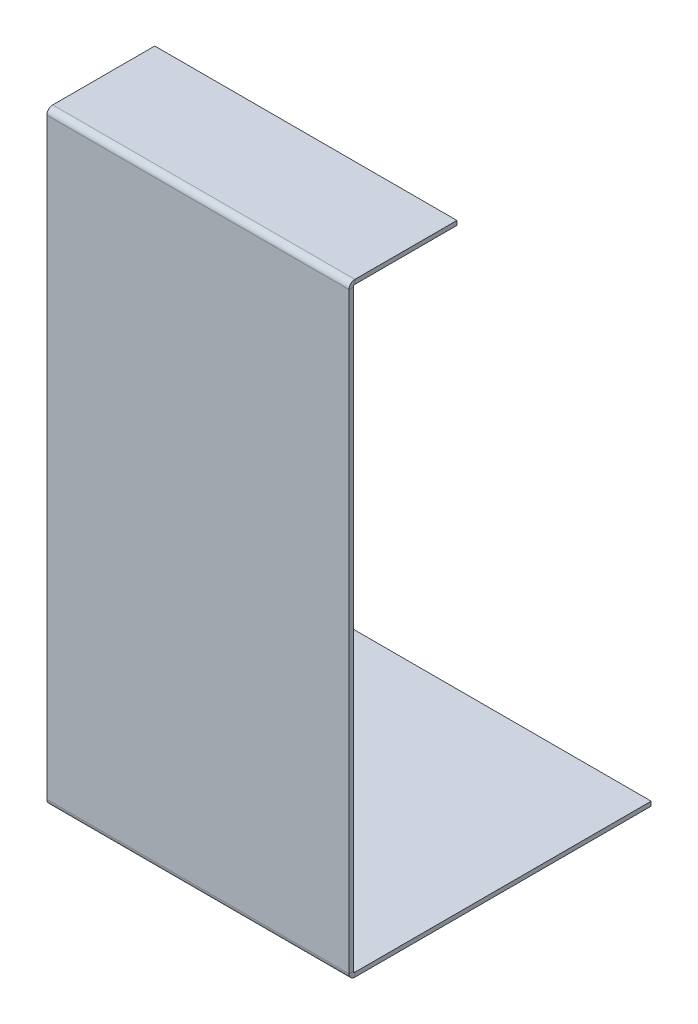
ISO-10303-21;
HEADER;
FILE_DESCRIPTION(('STEP AP214'),'2;1');
FILE_NAME('part.step','',(''),(''),'','','');
FILE_SCHEMA(('AUTOMOTIVE_DESIGN { 1 0 10303 214 1 1 1 1 }'));
ENDSEC;
DATA;
#1=APPLICATION_CONTEXT('core data for automotive mechanical design processes');
#2=APPLICATION_PROTOCOL_DEFINITION('international standard','automotive_design',2000,#1);
#3=PRODUCT_CONTEXT('',#1,'mechanical');
#4=PRODUCT('Part','Part','',(#3));
#5=PRODUCT_RELATED_PRODUCT_CATEGORY('part','',(#4));
#6=PRODUCT_DEFINITION_FORMATION('','',#4);
#7=PRODUCT_DEFINITION_CONTEXT('part definition',#1,'design');
#8=PRODUCT_DEFINITION('design','',#6,#7);
#9=PRODUCT_DEFINITION_SHAPE('','',#8);
#10=(LENGTH_UNIT() NAMED_UNIT(*) SI_UNIT(.MILLI.,.METRE.));
#11=(NAMED_UNIT(*) PLANE_ANGLE_UNIT() SI_UNIT($,.RADIAN.));
#12=(NAMED_UNIT(*) SI_UNIT($,.STERADIAN.) SOLID_ANGLE_UNIT());
#13=UNCERTAINTY_MEASURE_WITH_UNIT(LENGTH_MEASURE(1.E-05),#10,'distance_accuracy_value','');
#14=(GEOMETRIC_REPRESENTATION_CONTEXT(3) GLOBAL_UNCERTAINTY_ASSIGNED_CONTEXT((#13)) GLOBAL_UNIT_ASSIGNED_CONTEXT((#10,
#11,#12)) REPRESENTATION_CONTEXT('',''));
#15=CARTESIAN_POINT('',(0.,0.,0.));
#16=DIRECTION('',(0.,0.,1.));
#17=DIRECTION('',(1.,0.,0.));
#18=AXIS2_PLACEMENT_3D('',#15,#16,#17);
#19=CARTESIAN_POINT('',(-78.7205387205387,0.,95.5331088664422));
#20=DIRECTION('',(1.,0.,0.));
#21=DIRECTION('',(0.,0.,-1.));
#22=AXIS2_PLACEMENT_3D('',#19,#20,#21);
#23=PLANE('',#22);
#24=DIRECTION('',(0.,0.,1.));
#25=VECTOR('',#24,1.);
#26=CARTESIAN_POINT('',(-78.7205387205387,275.2634,93.5331088664422));
#27=LINE('',#26,#25);
#28=CARTESIAN_POINT('',(-78.7205387205387,275.2634,93.5331088664422));
#29=VERTEX_POINT('',#28);
#30=CARTESIAN_POINT('',(-78.7205387205387,275.2634,95.5331088664422));
#31=VERTEX_POINT('',#30);
#32=EDGE_CURVE('E230',#29,#31,#27,.T.);
#33=ORIENTED_EDGE('',*,*,#32,.F.);
#34=DIRECTION('',(0.,1.,0.));
#35=VECTOR('',#34,1.);
#36=CARTESIAN_POINT('',(-78.7205387205387,0.,93.5331088664422));
#37=LINE('',#36,#35);
#38=CARTESIAN_POINT('',(-78.7205387205387,0.736600000000004,93.5331088664422));
#39=VERTEX_POINT('',#38);
#40=EDGE_CURVE('E243',#29,#39,#37,.F.);
#41=ORIENTED_EDGE('',*,*,#40,.T.);
#42=DIRECTION('',(0.,0.,-1.));
#43=VECTOR('',#42,1.);
#44=CARTESIAN_POINT('',(-78.7205387205387,0.736600000000004,95.5331088664422));
#45=LINE('',#44,#43);
#46=CARTESIAN_POINT('',(-78.7205387205387,0.736600000000004,95.5331088664422));
#47=VERTEX_POINT('',#46);
#48=EDGE_CURVE('E233',#39,#47,#45,.F.);
#49=ORIENTED_EDGE('',*,*,#48,.T.);
#50=DIRECTION('',(0.,-1.,0.));
#51=VECTOR('',#50,1.);
#52=CARTESIAN_POINT('',(-78.7205387205387,0.,95.5331088664422));
#53=LINE('',#52,#51);
#54=EDGE_CURVE('E239',#31,#47,#53,.T.);
#55=ORIENTED_EDGE('',*,*,#54,.F.);
#56=EDGE_LOOP('',(#33,#41,#49,#55));
#57=FACE_BOUND('',#56,.T.);
#58=ADVANCED_FACE('F81',(#57),#23,.F.);
#59=CARTESIAN_POINT('',(61.2794612794613,278.,95.5331088664422));
#60=DIRECTION('',(-1.,0.,0.));
#61=DIRECTION('',(0.,0.,1.));
#62=AXIS2_PLACEMENT_3D('',#59,#60,#61);
#63=PLANE('',#62);
#64=DIRECTION('',(0.,0.,1.));
#65=VECTOR('',#64,1.);
#66=CARTESIAN_POINT('',(61.2794612794613,275.2634,93.5331088664422));
#67=LINE('',#66,#65);
#68=CARTESIAN_POINT('',(61.2794612794613,275.2634,93.5331088664422));
#69=VERTEX_POINT('',#68);
#70=CARTESIAN_POINT('',(61.2794612794613,275.2634,95.5331088664422));
#71=VERTEX_POINT('',#70);
#72=EDGE_CURVE('E220',#69,#71,#67,.T.);
#73=ORIENTED_EDGE('',*,*,#72,.T.);
#74=DIRECTION('',(0.,1.,0.));
#75=VECTOR('',#74,1.);
#76=CARTESIAN_POINT('',(61.2794612794613,0.,95.5331088664422));
#77=LINE('',#76,#75);
#78=CARTESIAN_POINT('',(61.2794612794613,0.736600000000004,95.5331088664422));
#79=VERTEX_POINT('',#78);
#80=EDGE_CURVE('E236',#79,#71,#77,.T.);
#81=ORIENTED_EDGE('',*,*,#80,.F.);
#82=DIRECTION('',(0.,0.,-1.));
#83=VECTOR('',#82,1.);
#84=CARTESIAN_POINT('',(61.2794612794613,0.736600000000004,93.5331088664422));
#85=LINE('',#84,#83);
#86=CARTESIAN_POINT('',(61.2794612794613,0.736600000000004,93.5331088664422));
#87=VERTEX_POINT('',#86);
#88=EDGE_CURVE('E248',#87,#79,#85,.F.);
#89=ORIENTED_EDGE('',*,*,#88,.F.);
#90=DIRECTION('',(0.,-1.,0.));
#91=VECTOR('',#90,1.);
#92=CARTESIAN_POINT('',(61.2794612794613,278.,93.5331088664422));
#93=LINE('',#92,#91);
#94=EDGE_CURVE('E241',#87,#69,#93,.F.);
#95=ORIENTED_EDGE('',*,*,#94,.T.);
#96=EDGE_LOOP('',(#73,#81,#89,#95));
#97=FACE_BOUND('',#96,.T.);
#98=ADVANCED_FACE('F314',(#97),#63,.F.);
#99=CARTESIAN_POINT('',(0.,0.,95.5331088664422));
#100=DIRECTION('',(0.,0.,-1.));
#101=DIRECTION('',(-1.,0.,0.));
#102=AXIS2_PLACEMENT_3D('',#99,#100,#101);
#103=PLANE('',#102);
#104=DIRECTION('',(1.,0.,0.));
#105=VECTOR('',#104,1.);
#106=CARTESIAN_POINT('',(61.2794612794613,275.2634,95.5331088664422));
#107=LINE('',#106,#105);
#108=EDGE_CURVE('E214',#71,#31,#107,.F.);
#109=ORIENTED_EDGE('',*,*,#108,.T.);
#110=ORIENTED_EDGE('',*,*,#54,.T.);
#111=DIRECTION('',(1.,0.,0.));
#112=VECTOR('',#111,1.);
#113=CARTESIAN_POINT('',(-78.7205387205387,0.736600000000004,95.5331088664422));
#114=LINE('',#113,#112);
#115=EDGE_CURVE('E245',#79,#47,#114,.F.);
#116=ORIENTED_EDGE('',*,*,#115,.F.);
#117=ORIENTED_EDGE('',*,*,#80,.T.);
#118=EDGE_LOOP('',(#109,#110,#116,#117));
#119=FACE_BOUND('',#118,.T.);
#120=ADVANCED_FACE('F310',(#119),#103,.F.);
#121=CARTESIAN_POINT('',(0.,0.,93.5331088664422));
#122=DIRECTION('',(0.,0.,-1.));
#123=DIRECTION('',(-1.,0.,0.));
#124=AXIS2_PLACEMENT_3D('',#121,#122,#123);
#125=PLANE('',#124);
#126=ORIENTED_EDGE('',*,*,#40,.F.);
#127=DIRECTION('',(1.,0.,0.));
#128=VECTOR('',#127,1.);
#129=CARTESIAN_POINT('',(61.2794612794613,275.2634,93.5331088664422));
#130=LINE('',#129,#128);
#131=EDGE_CURVE('E96',#69,#29,#130,.F.);
#132=ORIENTED_EDGE('',*,*,#131,.F.);
#133=ORIENTED_EDGE('',*,*,#94,.F.);
#134=DIRECTION('',(1.,0.,0.));
#135=VECTOR('',#134,1.);
#136=CARTESIAN_POINT('',(-78.7205387205387,0.736600000000004,93.5331088664422));
#137=LINE('',#136,#135);
#138=EDGE_CURVE('E251',#39,#87,#137,.T.);
#139=ORIENTED_EDGE('',*,*,#138,.F.);
#140=EDGE_LOOP('',(#126,#132,#133,#139));
#141=FACE_BOUND('',#140,.T.);
#142=ADVANCED_FACE('F337',(#141),#125,.T.);
#143=CARTESIAN_POINT('',(61.2794612794613,-2.,-44.4668911335578));
#144=DIRECTION('',(1.,0.,0.));
#145=DIRECTION('',(0.,0.,-1.));
#146=AXIS2_PLACEMENT_3D('',#143,#144,#145);
#147=PLANE('',#146);
#148=DIRECTION('',(0.,0.,-1.));
#149=VECTOR('',#148,1.);
#150=CARTESIAN_POINT('',(61.2794612794613,0.,-44.4668911335578));
#151=LINE('',#150,#149);
#152=CARTESIAN_POINT('',(61.2794612794613,0.,92.7965088664422));
#153=VERTEX_POINT('',#152);
#154=CARTESIAN_POINT('',(61.2794612794613,0.,-44.4668911335578));
#155=VERTEX_POINT('',#154);
#156=EDGE_CURVE('E286',#153,#155,#151,.T.);
#157=ORIENTED_EDGE('',*,*,#156,.F.);
#158=DIRECTION('',(0.,-1.,0.));
#159=VECTOR('',#158,1.);
#160=CARTESIAN_POINT('',(61.2794612794613,0.,92.7965088664422));
#161=LINE('',#160,#159);
#162=CARTESIAN_POINT('',(61.2794612794613,-2.,92.7965088664422));
#163=VERTEX_POINT('',#162);
#164=EDGE_CURVE('E261',#153,#163,#161,.T.);
#165=ORIENTED_EDGE('',*,*,#164,.T.);
#166=DIRECTION('',(0.,0.,-1.));
#167=VECTOR('',#166,1.);
#168=CARTESIAN_POINT('',(61.2794612794613,-2.,-44.4668911335578));
#169=LINE('',#168,#167);
#170=CARTESIAN_POINT('',(61.2794612794613,-2.,-44.4668911335578));
#171=VERTEX_POINT('',#170);
#172=EDGE_CURVE('E279',#163,#171,#169,.T.);
#173=ORIENTED_EDGE('',*,*,#172,.T.);
#174=DIRECTION('',(0.,1.,0.));
#175=VECTOR('',#174,1.);
#176=CARTESIAN_POINT('',(61.2794612794613,-2.,-44.4668911335578));
#177=LINE('',#176,#175);
#178=EDGE_CURVE('E85',#171,#155,#177,.T.);
#179=ORIENTED_EDGE('',*,*,#178,.T.);
#180=EDGE_LOOP('',(#157,#165,#173,#179));
#181=FACE_BOUND('',#180,.T.);
#182=ADVANCED_FACE('F345',(#181),#147,.T.);
#183=CARTESIAN_POINT('',(0.,-2.,0.));
#184=DIRECTION('',(0.,1.,0.));
#185=DIRECTION('',(0.,0.,1.));
#186=AXIS2_PLACEMENT_3D('',#183,#184,#185);
#187=PLANE('',#186);
#188=DIRECTION('',(1.,0.,0.));
#189=VECTOR('',#188,1.);
#190=CARTESIAN_POINT('',(61.2794612794613,-2.,92.7965088664422));
#191=LINE('',#190,#189);
#192=CARTESIAN_POINT('',(-78.7205387205387,-2.,92.7965088664422));
#193=VERTEX_POINT('',#192);
#194=EDGE_CURVE('E255',#163,#193,#191,.F.);
#195=ORIENTED_EDGE('',*,*,#194,.T.);
#196=DIRECTION('',(0.,0.,1.));
#197=VECTOR('',#196,1.);
#198=CARTESIAN_POINT('',(-78.7205387205387,-2.,-44.4668911335578));
#199=LINE('',#198,#197);
#200=CARTESIAN_POINT('',(-78.7205387205387,-2.,-44.4668911335578));
#201=VERTEX_POINT('',#200);
#202=EDGE_CURVE('E276',#201,#193,#199,.T.);
#203=ORIENTED_EDGE('',*,*,#202,.F.);
#204=DIRECTION('',(-1.,0.,0.));
#205=VECTOR('',#204,1.);
#206=CARTESIAN_POINT('',(-78.7205387205387,-2.,-44.4668911335578));
#207=LINE('',#206,#205);
#208=EDGE_CURVE('E282',#171,#201,#207,.T.);
#209=ORIENTED_EDGE('',*,*,#208,.F.);
#210=ORIENTED_EDGE('',*,*,#172,.F.);
#211=EDGE_LOOP('',(#195,#203,#209,#210));
#212=FACE_BOUND('',#211,.T.);
#213=ADVANCED_FACE('F347',(#212),#187,.F.);
#214=CARTESIAN_POINT('',(0.,0.,0.));
#215=DIRECTION('',(0.,1.,0.));
#216=DIRECTION('',(0.,0.,1.));
#217=AXIS2_PLACEMENT_3D('',#214,#215,#216);
#218=PLANE('',#217);
#219=DIRECTION('',(0.,0.,1.));
#220=VECTOR('',#219,1.);
#221=CARTESIAN_POINT('',(-78.7205387205387,0.,-44.4668911335578));
#222=LINE('',#221,#220);
#223=CARTESIAN_POINT('',(-78.7205387205387,0.,-44.4668911335578));
#224=VERTEX_POINT('',#223);
#225=CARTESIAN_POINT('',(-78.7205387205387,0.,92.7965088664422));
#226=VERTEX_POINT('',#225);
#227=EDGE_CURVE('E273',#224,#226,#222,.T.);
#228=ORIENTED_EDGE('',*,*,#227,.T.);
#229=DIRECTION('',(1.,0.,0.));
#230=VECTOR('',#229,1.);
#231=CARTESIAN_POINT('',(61.2794612794613,0.,92.7965088664422));
#232=LINE('',#231,#230);
#233=EDGE_CURVE('E104',#153,#226,#232,.F.);
#234=ORIENTED_EDGE('',*,*,#233,.F.);
#235=ORIENTED_EDGE('',*,*,#156,.T.);
#236=DIRECTION('',(-1.,0.,0.));
#237=VECTOR('',#236,1.);
#238=CARTESIAN_POINT('',(-78.7205387205387,0.,-44.4668911335578));
#239=LINE('',#238,#237);
#240=EDGE_CURVE('E280',#155,#224,#239,.T.);
#241=ORIENTED_EDGE('',*,*,#240,.T.);
#242=EDGE_LOOP('',(#228,#234,#235,#241));
#243=FACE_BOUND('',#242,.T.);
#244=ADVANCED_FACE('F290',(#243),#218,.T.);
#245=CARTESIAN_POINT('',(-78.7205387205387,-2.,-44.4668911335578));
#246=DIRECTION('',(-1.,0.,0.));
#247=DIRECTION('',(0.,0.,1.));
#248=AXIS2_PLACEMENT_3D('',#245,#246,#247);
#249=PLANE('',#248);
#250=DIRECTION('',(0.,-1.,0.));
#251=VECTOR('',#250,1.);
#252=CARTESIAN_POINT('',(-78.7205387205387,0.,92.7965088664422));
#253=LINE('',#252,#251);
#254=EDGE_CURVE('E270',#226,#193,#253,.T.);
#255=ORIENTED_EDGE('',*,*,#254,.F.);
#256=ORIENTED_EDGE('',*,*,#227,.F.);
#257=DIRECTION('',(0.,1.,0.));
#258=VECTOR('',#257,1.);
#259=CARTESIAN_POINT('',(-78.7205387205387,-2.,-44.4668911335578));
#260=LINE('',#259,#258);
#261=EDGE_CURVE('E13',#201,#224,#260,.T.);
#262=ORIENTED_EDGE('',*,*,#261,.F.);
#263=ORIENTED_EDGE('',*,*,#202,.T.);
#264=EDGE_LOOP('',(#255,#256,#262,#263));
#265=FACE_BOUND('',#264,.T.);
#266=ADVANCED_FACE('F83',(#265),#249,.T.);
#267=CARTESIAN_POINT('',(-78.7205387205387,-2.,-44.4668911335578));
#268=DIRECTION('',(0.,0.,-1.));
#269=DIRECTION('',(-1.,0.,0.));
#270=AXIS2_PLACEMENT_3D('',#267,#268,#269);
#271=PLANE('',#270);
#272=ORIENTED_EDGE('',*,*,#240,.F.);
#273=ORIENTED_EDGE('',*,*,#178,.F.);
#274=ORIENTED_EDGE('',*,*,#208,.T.);
#275=ORIENTED_EDGE('',*,*,#261,.T.);
#276=EDGE_LOOP('',(#272,#273,#274,#275));
#277=FACE_BOUND('',#276,.T.);
#278=ADVANCED_FACE('F295',(#277),#271,.T.);
#279=CARTESIAN_POINT('',(-78.7205387205387,0.736600000000004,92.7965088664422));
#280=DIRECTION('',(-1.,0.,0.));
#281=DIRECTION('',(0.,0.,1.));
#282=AXIS2_PLACEMENT_3D('',#279,#280,#281);
#283=PLANE('',#282);
#284=ORIENTED_EDGE('',*,*,#48,.F.);
#285=CARTESIAN_POINT('',(-78.7205387205387,0.736600000000004,92.7965088664422));
#286=DIRECTION('',(1.,0.,0.));
#287=DIRECTION('',(0.,0.,-1.));
#288=AXIS2_PLACEMENT_3D('',#285,#286,#287);
#289=CIRCLE('',#288,0.736600000000004);
#290=EDGE_CURVE('E264',#226,#39,#289,.F.);
#291=ORIENTED_EDGE('',*,*,#290,.F.);
#292=ORIENTED_EDGE('',*,*,#254,.T.);
#293=CARTESIAN_POINT('',(-78.7205387205387,0.736600000000004,92.7965088664422));
#294=DIRECTION('',(1.,0.,0.));
#295=DIRECTION('',(0.,0.,-1.));
#296=AXIS2_PLACEMENT_3D('',#293,#294,#295);
#297=CIRCLE('',#296,2.7366);
#298=EDGE_CURVE('E257',#193,#47,#297,.F.);
#299=ORIENTED_EDGE('',*,*,#298,.T.);
#300=EDGE_LOOP('',(#284,#291,#292,#299));
#301=FACE_BOUND('',#300,.T.);
#302=ADVANCED_FACE('F303',(#301),#283,.T.);
#303=CARTESIAN_POINT('',(61.2794612794613,0.736600000000004,92.7965088664422));
#304=DIRECTION('',(-1.,0.,0.));
#305=DIRECTION('',(0.,0.,1.));
#306=AXIS2_PLACEMENT_3D('',#303,#304,#305);
#307=PLANE('',#306);
#308=CARTESIAN_POINT('',(61.2794612794613,0.736600000000004,92.7965088664422));
#309=DIRECTION('',(1.,0.,0.));
#310=DIRECTION('',(0.,0.,-1.));
#311=AXIS2_PLACEMENT_3D('',#308,#309,#310);
#312=CIRCLE('',#311,0.736600000000004);
#313=EDGE_CURVE('E238',#87,#153,#312,.T.);
#314=ORIENTED_EDGE('',*,*,#313,.F.);
#315=ORIENTED_EDGE('',*,*,#88,.T.);
#316=CARTESIAN_POINT('',(61.2794612794613,0.736600000000004,92.7965088664422));
#317=DIRECTION('',(1.,0.,0.));
#318=DIRECTION('',(0.,0.,-1.));
#319=AXIS2_PLACEMENT_3D('',#316,#317,#318);
#320=CIRCLE('',#319,2.7366);
#321=EDGE_CURVE('E258',#79,#163,#320,.T.);
#322=ORIENTED_EDGE('',*,*,#321,.T.);
#323=ORIENTED_EDGE('',*,*,#164,.F.);
#324=EDGE_LOOP('',(#314,#315,#322,#323));
#325=FACE_BOUND('',#324,.T.);
#326=ADVANCED_FACE('F343',(#325),#307,.F.);
#327=CARTESIAN_POINT('',(61.2794612794613,0.736600000000004,92.7965088664422));
#328=DIRECTION('',(1.,0.,0.));
#329=DIRECTION('',(0.,0.,1.));
#330=AXIS2_PLACEMENT_3D('',#327,#328,#329);
#331=CYLINDRICAL_SURFACE('',#330,2.7366);
#332=ORIENTED_EDGE('',*,*,#194,.F.);
#333=ORIENTED_EDGE('',*,*,#321,.F.);
#334=ORIENTED_EDGE('',*,*,#115,.T.);
#335=ORIENTED_EDGE('',*,*,#298,.F.);
#336=EDGE_LOOP('',(#332,#333,#334,#335));
#337=FACE_BOUND('',#336,.T.);
#338=ADVANCED_FACE('F306',(#337),#331,.T.);
#339=CARTESIAN_POINT('',(61.2794612794613,0.736600000000004,92.7965088664422));
#340=DIRECTION('',(1.,0.,0.));
#341=DIRECTION('',(0.,0.,1.));
#342=AXIS2_PLACEMENT_3D('',#339,#340,#341);
#343=CYLINDRICAL_SURFACE('',#342,0.736600000000004);
#344=ORIENTED_EDGE('',*,*,#233,.T.);
#345=ORIENTED_EDGE('',*,*,#290,.T.);
#346=ORIENTED_EDGE('',*,*,#138,.T.);
#347=ORIENTED_EDGE('',*,*,#313,.T.);
#348=EDGE_LOOP('',(#344,#345,#346,#347));
#349=FACE_BOUND('',#348,.T.);
#350=ADVANCED_FACE('F340',(#349),#343,.F.);
#351=CARTESIAN_POINT('',(-78.7205387205387,275.2634,92.7965088664422));
#352=DIRECTION('',(-1.,0.,0.));
#353=DIRECTION('',(0.,0.,1.));
#354=AXIS2_PLACEMENT_3D('',#351,#352,#353);
#355=PLANE('',#354);
#356=DIRECTION('',(0.,-1.,0.));
#357=VECTOR('',#356,1.);
#358=CARTESIAN_POINT('',(-78.7205387205387,278.,92.7965088664422));
#359=LINE('',#358,#357);
#360=CARTESIAN_POINT('',(-78.7205387205387,276.,92.7965088664422));
#361=VERTEX_POINT('',#360);
#362=CARTESIAN_POINT('',(-78.7205387205387,278.,92.7965088664422));
#363=VERTEX_POINT('',#362);
#364=EDGE_CURVE('E196',#361,#363,#359,.F.);
#365=ORIENTED_EDGE('',*,*,#364,.F.);
#366=CARTESIAN_POINT('',(-78.7205387205387,275.2634,92.7965088664422));
#367=DIRECTION('',(1.,0.,0.));
#368=DIRECTION('',(0.,0.,-1.));
#369=AXIS2_PLACEMENT_3D('',#366,#367,#368);
#370=CIRCLE('',#369,0.736599999999976);
#371=EDGE_CURVE('E223',#29,#361,#370,.F.);
#372=ORIENTED_EDGE('',*,*,#371,.F.);
#373=ORIENTED_EDGE('',*,*,#32,.T.);
#374=CARTESIAN_POINT('',(-78.7205387205387,275.2634,92.7965088664422));
#375=DIRECTION('',(1.,0.,0.));
#376=DIRECTION('',(0.,0.,-1.));
#377=AXIS2_PLACEMENT_3D('',#374,#375,#376);
#378=CIRCLE('',#377,2.73659999999998);
#379=EDGE_CURVE('E216',#31,#363,#378,.F.);
#380=ORIENTED_EDGE('',*,*,#379,.T.);
#381=EDGE_LOOP('',(#365,#372,#373,#380));
#382=FACE_BOUND('',#381,.T.);
#383=ADVANCED_FACE('F334',(#382),#355,.T.);
#384=CARTESIAN_POINT('',(61.2794612794613,275.2634,92.7965088664422));
#385=DIRECTION('',(-1.,0.,0.));
#386=DIRECTION('',(0.,0.,1.));
#387=AXIS2_PLACEMENT_3D('',#384,#385,#386);
#388=PLANE('',#387);
#389=CARTESIAN_POINT('',(61.2794612794613,275.2634,92.7965088664422));
#390=DIRECTION('',(1.,0.,0.));
#391=DIRECTION('',(0.,0.,-1.));
#392=AXIS2_PLACEMENT_3D('',#389,#390,#391);
#393=CIRCLE('',#392,0.736599999999976);
#394=CARTESIAN_POINT('',(61.2794612794613,276.,92.7965088664422));
#395=VERTEX_POINT('',#394);
#396=EDGE_CURVE('E227',#395,#69,#393,.T.);
#397=ORIENTED_EDGE('',*,*,#396,.F.);
#398=DIRECTION('',(0.,-1.,0.));
#399=VECTOR('',#398,1.);
#400=CARTESIAN_POINT('',(61.2794612794613,276.,92.7965088664422));
#401=LINE('',#400,#399);
#402=CARTESIAN_POINT('',(61.2794612794613,278.,92.7965088664422));
#403=VERTEX_POINT('',#402);
#404=EDGE_CURVE('E208',#395,#403,#401,.F.);
#405=ORIENTED_EDGE('',*,*,#404,.T.);
#406=CARTESIAN_POINT('',(61.2794612794613,275.2634,92.7965088664422));
#407=DIRECTION('',(1.,0.,0.));
#408=DIRECTION('',(0.,0.,-1.));
#409=AXIS2_PLACEMENT_3D('',#406,#407,#408);
#410=CIRCLE('',#409,2.73659999999998);
#411=EDGE_CURVE('E217',#403,#71,#410,.T.);
#412=ORIENTED_EDGE('',*,*,#411,.T.);
#413=ORIENTED_EDGE('',*,*,#72,.F.);
#414=EDGE_LOOP('',(#397,#405,#412,#413));
#415=FACE_BOUND('',#414,.T.);
#416=ADVANCED_FACE('F322',(#415),#388,.F.);
#417=CARTESIAN_POINT('',(61.2794612794613,275.2634,92.7965088664422));
#418=DIRECTION('',(1.,0.,0.));
#419=DIRECTION('',(0.,1.,0.));
#420=AXIS2_PLACEMENT_3D('',#417,#418,#419);
#421=CYLINDRICAL_SURFACE('',#420,2.73659999999998);
#422=ORIENTED_EDGE('',*,*,#108,.F.);
#423=ORIENTED_EDGE('',*,*,#411,.F.);
#424=DIRECTION('',(1.,0.,0.));
#425=VECTOR('',#424,1.);
#426=CARTESIAN_POINT('',(-78.7205387205387,278.,92.7965088664422));
#427=LINE('',#426,#425);
#428=EDGE_CURVE('E206',#403,#363,#427,.F.);
#429=ORIENTED_EDGE('',*,*,#428,.T.);
#430=ORIENTED_EDGE('',*,*,#379,.F.);
#431=EDGE_LOOP('',(#422,#423,#429,#430));
#432=FACE_BOUND('',#431,.T.);
#433=ADVANCED_FACE('F321',(#432),#421,.T.);
#434=CARTESIAN_POINT('',(61.2794612794613,275.2634,92.7965088664422));
#435=DIRECTION('',(1.,0.,0.));
#436=DIRECTION('',(0.,1.,0.));
#437=AXIS2_PLACEMENT_3D('',#434,#435,#436);
#438=CYLINDRICAL_SURFACE('',#437,0.736599999999976);
#439=ORIENTED_EDGE('',*,*,#131,.T.);
#440=ORIENTED_EDGE('',*,*,#371,.T.);
#441=DIRECTION('',(1.,0.,0.));
#442=VECTOR('',#441,1.);
#443=CARTESIAN_POINT('',(-78.7205387205387,276.,92.7965088664422));
#444=LINE('',#443,#442);
#445=EDGE_CURVE('E211',#361,#395,#444,.T.);
#446=ORIENTED_EDGE('',*,*,#445,.T.);
#447=ORIENTED_EDGE('',*,*,#396,.T.);
#448=EDGE_LOOP('',(#439,#440,#446,#447));
#449=FACE_BOUND('',#448,.T.);
#450=ADVANCED_FACE('F331',(#449),#438,.F.);
#451=CARTESIAN_POINT('',(61.2794612794613,278.,45.5331088664422));
#452=DIRECTION('',(-1.,0.,0.));
#453=DIRECTION('',(0.,0.,1.));
#454=AXIS2_PLACEMENT_3D('',#451,#452,#453);
#455=PLANE('',#454);
#456=ORIENTED_EDGE('',*,*,#404,.F.);
#457=DIRECTION('',(0.,0.,1.));
#458=VECTOR('',#457,1.);
#459=CARTESIAN_POINT('',(61.2794612794613,276.,45.5331088664422));
#460=LINE('',#459,#458);
#461=CARTESIAN_POINT('',(61.2794612794613,276.,45.5331088664422));
#462=VERTEX_POINT('',#461);
#463=EDGE_CURVE('E204',#395,#462,#460,.F.);
#464=ORIENTED_EDGE('',*,*,#463,.T.);
#465=DIRECTION('',(0.,-1.,0.));
#466=VECTOR('',#465,1.);
#467=CARTESIAN_POINT('',(61.2794612794613,278.,45.5331088664422));
#468=LINE('',#467,#466);
#469=CARTESIAN_POINT('',(61.2794612794613,278.,45.5331088664422));
#470=VERTEX_POINT('',#469);
#471=EDGE_CURVE('E192',#470,#462,#468,.T.);
#472=ORIENTED_EDGE('',*,*,#471,.F.);
#473=DIRECTION('',(0.,0.,-1.));
#474=VECTOR('',#473,1.);
#475=CARTESIAN_POINT('',(61.2794612794613,278.,9.71489215320792E-13));
#476=LINE('',#475,#474);
#477=EDGE_CURVE('E179',#403,#470,#476,.T.);
#478=ORIENTED_EDGE('',*,*,#477,.F.);
#479=EDGE_LOOP('',(#456,#464,#472,#478));
#480=FACE_BOUND('',#479,.T.);
#481=ADVANCED_FACE('F326',(#480),#455,.F.);
#482=CARTESIAN_POINT('',(-78.7205387205387,278.,93.5331088664422));
#483=DIRECTION('',(1.,0.,0.));
#484=DIRECTION('',(0.,0.,-1.));
#485=AXIS2_PLACEMENT_3D('',#482,#483,#484);
#486=PLANE('',#485);
#487=ORIENTED_EDGE('',*,*,#364,.T.);
#488=DIRECTION('',(0.,0.,1.));
#489=VECTOR('',#488,1.);
#490=CARTESIAN_POINT('',(-78.7205387205387,278.,9.71489215320792E-13));
#491=LINE('',#490,#489);
#492=CARTESIAN_POINT('',(-78.7205387205387,278.,45.5331088664422));
#493=VERTEX_POINT('',#492);
#494=EDGE_CURVE('E177',#493,#363,#491,.T.);
#495=ORIENTED_EDGE('',*,*,#494,.F.);
#496=DIRECTION('',(0.,-1.,0.));
#497=VECTOR('',#496,1.);
#498=CARTESIAN_POINT('',(-78.7205387205387,278.,45.5331088664422));
#499=LINE('',#498,#497);
#500=CARTESIAN_POINT('',(-78.7205387205387,276.,45.5331088664422));
#501=VERTEX_POINT('',#500);
#502=EDGE_CURVE('E185',#493,#501,#499,.T.);
#503=ORIENTED_EDGE('',*,*,#502,.T.);
#504=DIRECTION('',(0.,0.,-1.));
#505=VECTOR('',#504,1.);
#506=CARTESIAN_POINT('',(-78.7205387205387,276.,93.5331088664422));
#507=LINE('',#506,#505);
#508=EDGE_CURVE('E201',#501,#361,#507,.F.);
#509=ORIENTED_EDGE('',*,*,#508,.T.);
#510=EDGE_LOOP('',(#487,#495,#503,#509));
#511=FACE_BOUND('',#510,.T.);
#512=ADVANCED_FACE('F195',(#511),#486,.F.);
#513=CARTESIAN_POINT('',(0.,278.,9.71489215320792E-13));
#514=DIRECTION('',(0.,-1.,0.));
#515=DIRECTION('',(0.,0.,-1.));
#516=AXIS2_PLACEMENT_3D('',#513,#514,#515);
#517=PLANE('',#516);
#518=ORIENTED_EDGE('',*,*,#428,.F.);
#519=ORIENTED_EDGE('',*,*,#477,.T.);
#520=DIRECTION('',(-1.,0.,0.));
#521=VECTOR('',#520,1.);
#522=CARTESIAN_POINT('',(0.,278.,45.5331088664422));
#523=LINE('',#522,#521);
#524=EDGE_CURVE('E172',#470,#493,#523,.T.);
#525=ORIENTED_EDGE('',*,*,#524,.T.);
#526=ORIENTED_EDGE('',*,*,#494,.T.);
#527=EDGE_LOOP('',(#518,#519,#525,#526));
#528=FACE_BOUND('',#527,.T.);
#529=ADVANCED_FACE('F175',(#528),#517,.F.);
#530=CARTESIAN_POINT('',(0.,276.,9.64506252643106E-13));
#531=DIRECTION('',(0.,-1.,0.));
#532=DIRECTION('',(0.,0.,-1.));
#533=AXIS2_PLACEMENT_3D('',#530,#531,#532);
#534=PLANE('',#533);
#535=ORIENTED_EDGE('',*,*,#463,.F.);
#536=ORIENTED_EDGE('',*,*,#445,.F.);
#537=ORIENTED_EDGE('',*,*,#508,.F.);
#538=DIRECTION('',(1.,0.,0.));
#539=VECTOR('',#538,1.);
#540=CARTESIAN_POINT('',(-78.7205387205387,276.,45.5331088664422));
#541=LINE('',#540,#539);
#542=EDGE_CURVE('E188',#462,#501,#541,.F.);
#543=ORIENTED_EDGE('',*,*,#542,.F.);
#544=EDGE_LOOP('',(#535,#536,#537,#543));
#545=FACE_BOUND('',#544,.T.);
#546=ADVANCED_FACE('F329',(#545),#534,.T.);
#547=CARTESIAN_POINT('',(-78.7205387205387,278.,45.5331088664422));
#548=DIRECTION('',(0.,0.,1.));
#549=DIRECTION('',(0.,-1.,0.));
#550=AXIS2_PLACEMENT_3D('',#547,#548,#549);
#551=PLANE('',#550);
#552=ORIENTED_EDGE('',*,*,#542,.T.);
#553=ORIENTED_EDGE('',*,*,#502,.F.);
#554=ORIENTED_EDGE('',*,*,#524,.F.);
#555=ORIENTED_EDGE('',*,*,#471,.T.);
#556=EDGE_LOOP('',(#552,#553,#554,#555));
#557=FACE_BOUND('',#556,.T.);
#558=ADVANCED_FACE('F186',(#557),#551,.F.);
#559=CLOSED_SHELL('',(#58,#98,#120,#142,#182,#213,#244,#266,#278,#302,#326,#338,#350,#383,#416,
#433,#450,#481,#512,#529,#546,#558));
#560=MANIFOLD_SOLID_BREP('B2',#559);
#561=ADVANCED_BREP_SHAPE_REPRESENTATION('',(#18,#560),#14);
#562=SHAPE_DEFINITION_REPRESENTATION(#9,#561);
ENDSEC;
END-ISO-10303-21;
